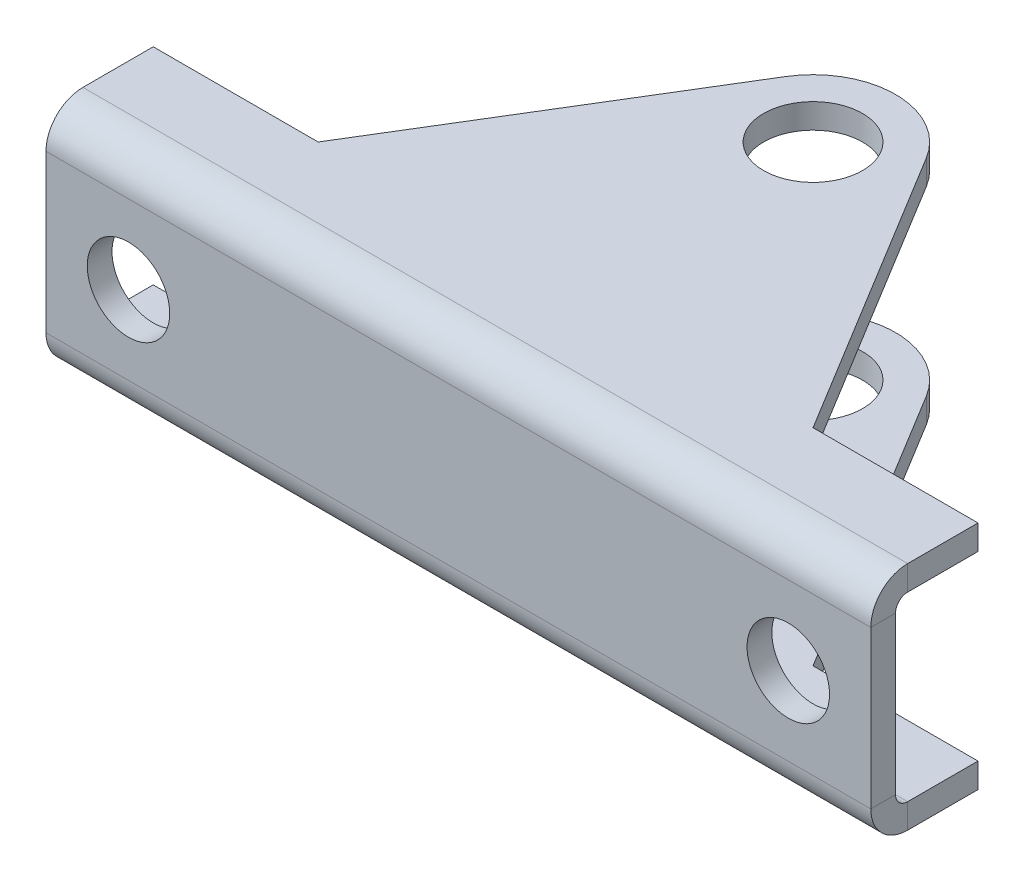
ISO-10303-21;
HEADER;
FILE_DESCRIPTION(('STEP AP214'),'2;1');
FILE_NAME('part.step','',(''),(''),'','','');
FILE_SCHEMA(('AUTOMOTIVE_DESIGN { 1 0 10303 214 1 1 1 1 }'));
ENDSEC;
DATA;
#1=APPLICATION_CONTEXT('core data for automotive mechanical design processes');
#2=APPLICATION_PROTOCOL_DEFINITION('international standard','automotive_design',2000,#1);
#3=PRODUCT_CONTEXT('',#1,'mechanical');
#4=PRODUCT('Part','Part','',(#3));
#5=PRODUCT_RELATED_PRODUCT_CATEGORY('part','',(#4));
#6=PRODUCT_DEFINITION_FORMATION('','',#4);
#7=PRODUCT_DEFINITION_CONTEXT('part definition',#1,'design');
#8=PRODUCT_DEFINITION('design','',#6,#7);
#9=PRODUCT_DEFINITION_SHAPE('','',#8);
#10=(LENGTH_UNIT() NAMED_UNIT(*) SI_UNIT(.MILLI.,.METRE.));
#11=(NAMED_UNIT(*) PLANE_ANGLE_UNIT() SI_UNIT($,.RADIAN.));
#12=(NAMED_UNIT(*) SI_UNIT($,.STERADIAN.) SOLID_ANGLE_UNIT());
#13=UNCERTAINTY_MEASURE_WITH_UNIT(LENGTH_MEASURE(1.E-05),#10,'distance_accuracy_value','');
#14=(GEOMETRIC_REPRESENTATION_CONTEXT(3) GLOBAL_UNCERTAINTY_ASSIGNED_CONTEXT((#13)) GLOBAL_UNIT_ASSIGNED_CONTEXT((#10,
#11,#12)) REPRESENTATION_CONTEXT('',''));
#15=CARTESIAN_POINT('',(0.,0.,0.));
#16=DIRECTION('',(0.,0.,1.));
#17=DIRECTION('',(1.,0.,0.));
#18=AXIS2_PLACEMENT_3D('',#15,#16,#17);
#19=CARTESIAN_POINT('',(25.,-7.00000000000002,-6.5));
#20=DIRECTION('',(0.,0.,-1.));
#21=DIRECTION('',(0.,1.,0.));
#22=AXIS2_PLACEMENT_3D('',#19,#20,#21);
#23=PLANE('',#22);
#24=DIRECTION('',(-1.,0.,0.));
#25=VECTOR('',#24,1.);
#26=CARTESIAN_POINT('',(25.,-5.50000000000002,-6.5));
#27=LINE('',#26,#25);
#28=CARTESIAN_POINT('',(-15.,-5.50000000000002,-6.50000000000002));
#29=VERTEX_POINT('',#28);
#30=CARTESIAN_POINT('',(-25.,-5.50000000000002,-6.5));
#31=VERTEX_POINT('',#30);
#32=EDGE_CURVE('E180',#29,#31,#27,.T.);
#33=ORIENTED_EDGE('',*,*,#32,.F.);
#34=DIRECTION('',(0.,-1.,0.));
#35=VECTOR('',#34,1.);
#36=CARTESIAN_POINT('',(-15.,-5.50000000000002,-6.50000000000002));
#37=LINE('',#36,#35);
#38=CARTESIAN_POINT('',(-15.,-7.00000000000002,-6.5));
#39=VERTEX_POINT('',#38);
#40=EDGE_CURVE('E187',#29,#39,#37,.T.);
#41=ORIENTED_EDGE('',*,*,#40,.T.);
#42=DIRECTION('',(-1.,0.,0.));
#43=VECTOR('',#42,1.);
#44=CARTESIAN_POINT('',(25.,-7.00000000000002,-6.5));
#45=LINE('',#44,#43);
#46=CARTESIAN_POINT('',(-25.,-7.00000000000002,-6.5));
#47=VERTEX_POINT('',#46);
#48=EDGE_CURVE('E403',#39,#47,#45,.T.);
#49=ORIENTED_EDGE('',*,*,#48,.T.);
#50=DIRECTION('',(0.,1.,0.));
#51=VECTOR('',#50,1.);
#52=CARTESIAN_POINT('',(-25.,-7.00000000000002,-6.5));
#53=LINE('',#52,#51);
#54=EDGE_CURVE('E195',#47,#31,#53,.T.);
#55=ORIENTED_EDGE('',*,*,#54,.T.);
#56=EDGE_LOOP('',(#33,#41,#49,#55));
#57=FACE_BOUND('',#56,.T.);
#58=ADVANCED_FACE('F35',(#57),#23,.T.);
#59=CARTESIAN_POINT('',(25.,7.00000000000002,-6.5));
#60=DIRECTION('',(0.,0.,-1.));
#61=DIRECTION('',(0.,1.,0.));
#62=AXIS2_PLACEMENT_3D('',#59,#60,#61);
#63=PLANE('',#62);
#64=DIRECTION('',(1.,0.,0.));
#65=VECTOR('',#64,1.);
#66=CARTESIAN_POINT('',(25.,5.50000000000002,-6.5));
#67=LINE('',#66,#65);
#68=CARTESIAN_POINT('',(15.,5.50000000000002,-6.50000000000002));
#69=VERTEX_POINT('',#68);
#70=CARTESIAN_POINT('',(25.,5.50000000000002,-6.5));
#71=VERTEX_POINT('',#70);
#72=EDGE_CURVE('E272',#69,#71,#67,.T.);
#73=ORIENTED_EDGE('',*,*,#72,.F.);
#74=DIRECTION('',(0.,1.,0.));
#75=VECTOR('',#74,1.);
#76=CARTESIAN_POINT('',(15.,5.50000000000002,-6.50000000000002));
#77=LINE('',#76,#75);
#78=CARTESIAN_POINT('',(15.,7.00000000000002,-6.5));
#79=VERTEX_POINT('',#78);
#80=EDGE_CURVE('E431',#69,#79,#77,.T.);
#81=ORIENTED_EDGE('',*,*,#80,.T.);
#82=DIRECTION('',(1.,0.,0.));
#83=VECTOR('',#82,1.);
#84=CARTESIAN_POINT('',(25.,7.00000000000002,-6.5));
#85=LINE('',#84,#83);
#86=CARTESIAN_POINT('',(25.,7.00000000000002,-6.5));
#87=VERTEX_POINT('',#86);
#88=EDGE_CURVE('E259',#79,#87,#85,.T.);
#89=ORIENTED_EDGE('',*,*,#88,.T.);
#90=DIRECTION('',(0.,-1.,0.));
#91=VECTOR('',#90,1.);
#92=CARTESIAN_POINT('',(25.,7.00000000000002,-6.5));
#93=LINE('',#92,#91);
#94=EDGE_CURVE('E282',#87,#71,#93,.T.);
#95=ORIENTED_EDGE('',*,*,#94,.T.);
#96=EDGE_LOOP('',(#73,#81,#89,#95));
#97=FACE_BOUND('',#96,.T.);
#98=ADVANCED_FACE('F473',(#97),#63,.T.);
#99=CARTESIAN_POINT('',(0.,0.,-1.5));
#100=DIRECTION('',(0.,0.,1.));
#101=DIRECTION('',(1.,0.,0.));
#102=AXIS2_PLACEMENT_3D('',#99,#100,#101);
#103=PLANE('',#102);
#104=CARTESIAN_POINT('',(20.,0.,-1.5));
#105=DIRECTION('',(0.,0.,1.));
#106=DIRECTION('',(1.,0.,0.));
#107=AXIS2_PLACEMENT_3D('',#104,#105,#106);
#108=CIRCLE('',#107,2.5);
#109=CARTESIAN_POINT('',(22.5,0.,-1.5));
#110=VERTEX_POINT('',#109);
#111=EDGE_CURVE('E312',#110,#110,#108,.T.);
#112=ORIENTED_EDGE('',*,*,#111,.T.);
#113=EDGE_LOOP('',(#112));
#114=FACE_BOUND('',#113,.T.);
#115=CARTESIAN_POINT('',(-20.,0.,-1.5));
#116=DIRECTION('',(0.,0.,1.));
#117=DIRECTION('',(1.,0.,0.));
#118=AXIS2_PLACEMENT_3D('',#115,#116,#117);
#119=CIRCLE('',#118,2.5);
#120=CARTESIAN_POINT('',(-17.5,0.,-1.5));
#121=VERTEX_POINT('',#120);
#122=EDGE_CURVE('E318',#121,#121,#119,.T.);
#123=ORIENTED_EDGE('',*,*,#122,.T.);
#124=EDGE_LOOP('',(#123));
#125=FACE_BOUND('',#124,.T.);
#126=DIRECTION('',(-1.,0.,0.));
#127=VECTOR('',#126,1.);
#128=CARTESIAN_POINT('',(-25.,-4.7634,-1.5));
#129=LINE('',#128,#127);
#130=CARTESIAN_POINT('',(-25.,-4.7634,-1.5));
#131=VERTEX_POINT('',#130);
#132=CARTESIAN_POINT('',(25.,-4.7634,-1.5));
#133=VERTEX_POINT('',#132);
#134=EDGE_CURVE('E236',#131,#133,#129,.F.);
#135=ORIENTED_EDGE('',*,*,#134,.F.);
#136=DIRECTION('',(0.,-1.,0.));
#137=VECTOR('',#136,1.);
#138=CARTESIAN_POINT('',(-25.,5.5,-1.5));
#139=LINE('',#138,#137);
#140=CARTESIAN_POINT('',(-25.,4.7634,-1.5));
#141=VERTEX_POINT('',#140);
#142=EDGE_CURVE('E11',#141,#131,#139,.T.);
#143=ORIENTED_EDGE('',*,*,#142,.F.);
#144=DIRECTION('',(1.,0.,0.));
#145=VECTOR('',#144,1.);
#146=CARTESIAN_POINT('',(25.,4.7634,-1.5));
#147=LINE('',#146,#145);
#148=CARTESIAN_POINT('',(25.,4.7634,-1.5));
#149=VERTEX_POINT('',#148);
#150=EDGE_CURVE('E302',#149,#141,#147,.F.);
#151=ORIENTED_EDGE('',*,*,#150,.F.);
#152=DIRECTION('',(0.,1.,0.));
#153=VECTOR('',#152,1.);
#154=CARTESIAN_POINT('',(25.,5.5,-1.5));
#155=LINE('',#154,#153);
#156=EDGE_CURVE('E44',#133,#149,#155,.T.);
#157=ORIENTED_EDGE('',*,*,#156,.F.);
#158=EDGE_LOOP('',(#135,#143,#151,#157));
#159=FACE_BOUND('',#158,.T.);
#160=ADVANCED_FACE('F350',(#114,#125,#159),#103,.F.);
#161=CARTESIAN_POINT('',(0.,0.,0.));
#162=DIRECTION('',(0.,0.,1.));
#163=DIRECTION('',(1.,0.,0.));
#164=AXIS2_PLACEMENT_3D('',#161,#162,#163);
#165=PLANE('',#164);
#166=CARTESIAN_POINT('',(20.,0.,0.));
#167=DIRECTION('',(0.,0.,1.));
#168=DIRECTION('',(1.,0.,0.));
#169=AXIS2_PLACEMENT_3D('',#166,#167,#168);
#170=CIRCLE('',#169,2.5);
#171=CARTESIAN_POINT('',(22.5,0.,0.));
#172=VERTEX_POINT('',#171);
#173=EDGE_CURVE('E309',#172,#172,#170,.T.);
#174=ORIENTED_EDGE('',*,*,#173,.F.);
#175=EDGE_LOOP('',(#174));
#176=FACE_BOUND('',#175,.T.);
#177=CARTESIAN_POINT('',(-20.,0.,0.));
#178=DIRECTION('',(0.,0.,1.));
#179=DIRECTION('',(1.,0.,0.));
#180=AXIS2_PLACEMENT_3D('',#177,#178,#179);
#181=CIRCLE('',#180,2.5);
#182=CARTESIAN_POINT('',(-17.5,0.,0.));
#183=VERTEX_POINT('',#182);
#184=EDGE_CURVE('E315',#183,#183,#181,.T.);
#185=ORIENTED_EDGE('',*,*,#184,.F.);
#186=EDGE_LOOP('',(#185));
#187=FACE_BOUND('',#186,.T.);
#188=DIRECTION('',(0.,-1.,0.));
#189=VECTOR('',#188,1.);
#190=CARTESIAN_POINT('',(-25.,5.5,0.));
#191=LINE('',#190,#189);
#192=CARTESIAN_POINT('',(-25.,4.7634,0.));
#193=VERTEX_POINT('',#192);
#194=CARTESIAN_POINT('',(-25.,-4.7634,0.));
#195=VERTEX_POINT('',#194);
#196=EDGE_CURVE('E325',#193,#195,#191,.T.);
#197=ORIENTED_EDGE('',*,*,#196,.T.);
#198=DIRECTION('',(-1.,0.,0.));
#199=VECTOR('',#198,1.);
#200=CARTESIAN_POINT('',(-25.,-4.7634,0.));
#201=LINE('',#200,#199);
#202=CARTESIAN_POINT('',(25.,-4.7634,0.));
#203=VERTEX_POINT('',#202);
#204=EDGE_CURVE('E223',#195,#203,#201,.F.);
#205=ORIENTED_EDGE('',*,*,#204,.T.);
#206=DIRECTION('',(0.,1.,0.));
#207=VECTOR('',#206,1.);
#208=CARTESIAN_POINT('',(25.,5.5,0.));
#209=LINE('',#208,#207);
#210=CARTESIAN_POINT('',(25.,4.7634,0.));
#211=VERTEX_POINT('',#210);
#212=EDGE_CURVE('E321',#203,#211,#209,.T.);
#213=ORIENTED_EDGE('',*,*,#212,.T.);
#214=DIRECTION('',(1.,0.,0.));
#215=VECTOR('',#214,1.);
#216=CARTESIAN_POINT('',(25.,4.7634,0.));
#217=LINE('',#216,#215);
#218=EDGE_CURVE('E289',#211,#193,#217,.F.);
#219=ORIENTED_EDGE('',*,*,#218,.T.);
#220=EDGE_LOOP('',(#197,#205,#213,#219));
#221=FACE_BOUND('',#220,.T.);
#222=ADVANCED_FACE('F331',(#176,#187,#221),#165,.T.);
#223=CARTESIAN_POINT('',(-25.,5.5,-1.5));
#224=DIRECTION('',(-1.,0.,0.));
#225=DIRECTION('',(0.,0.,1.));
#226=AXIS2_PLACEMENT_3D('',#223,#224,#225);
#227=PLANE('',#226);
#228=ORIENTED_EDGE('',*,*,#142,.T.);
#229=DIRECTION('',(0.,0.,1.));
#230=VECTOR('',#229,1.);
#231=CARTESIAN_POINT('',(-25.,-4.7634,-1.5));
#232=LINE('',#231,#230);
#233=EDGE_CURVE('E230',#131,#195,#232,.T.);
#234=ORIENTED_EDGE('',*,*,#233,.T.);
#235=ORIENTED_EDGE('',*,*,#196,.F.);
#236=DIRECTION('',(0.,0.,1.));
#237=VECTOR('',#236,1.);
#238=CARTESIAN_POINT('',(-25.,4.7634,-1.5));
#239=LINE('',#238,#237);
#240=EDGE_CURVE('E306',#141,#193,#239,.T.);
#241=ORIENTED_EDGE('',*,*,#240,.F.);
#242=EDGE_LOOP('',(#228,#234,#235,#241));
#243=FACE_BOUND('',#242,.T.);
#244=ADVANCED_FACE('F335',(#243),#227,.T.);
#245=CARTESIAN_POINT('',(25.,5.5,-1.5));
#246=DIRECTION('',(1.,0.,0.));
#247=DIRECTION('',(0.,0.,-1.));
#248=AXIS2_PLACEMENT_3D('',#245,#246,#247);
#249=PLANE('',#248);
#250=DIRECTION('',(0.,0.,1.));
#251=VECTOR('',#250,1.);
#252=CARTESIAN_POINT('',(25.,-4.7634,-1.5));
#253=LINE('',#252,#251);
#254=EDGE_CURVE('E240',#133,#203,#253,.T.);
#255=ORIENTED_EDGE('',*,*,#254,.F.);
#256=ORIENTED_EDGE('',*,*,#156,.T.);
#257=DIRECTION('',(0.,0.,1.));
#258=VECTOR('',#257,1.);
#259=CARTESIAN_POINT('',(25.,4.7634,-1.5));
#260=LINE('',#259,#258);
#261=EDGE_CURVE('E296',#149,#211,#260,.T.);
#262=ORIENTED_EDGE('',*,*,#261,.T.);
#263=ORIENTED_EDGE('',*,*,#212,.F.);
#264=EDGE_LOOP('',(#255,#256,#262,#263));
#265=FACE_BOUND('',#264,.T.);
#266=ADVANCED_FACE('F37',(#265),#249,.T.);
#267=CARTESIAN_POINT('',(-20.,0.,-1.5));
#268=DIRECTION('',(0.,0.,1.));
#269=DIRECTION('',(1.,0.,0.));
#270=AXIS2_PLACEMENT_3D('',#267,#268,#269);
#271=CYLINDRICAL_SURFACE('',#270,2.5);
#272=ORIENTED_EDGE('',*,*,#122,.F.);
#273=EDGE_LOOP('',(#272));
#274=FACE_BOUND('',#273,.T.);
#275=ORIENTED_EDGE('',*,*,#184,.T.);
#276=EDGE_LOOP('',(#275));
#277=FACE_BOUND('',#276,.T.);
#278=ADVANCED_FACE('F612',(#274,#277),#271,.F.);
#279=CARTESIAN_POINT('',(20.,0.,-1.5));
#280=DIRECTION('',(0.,0.,1.));
#281=DIRECTION('',(1.,0.,0.));
#282=AXIS2_PLACEMENT_3D('',#279,#280,#281);
#283=CYLINDRICAL_SURFACE('',#282,2.5);
#284=ORIENTED_EDGE('',*,*,#111,.F.);
#285=EDGE_LOOP('',(#284));
#286=FACE_BOUND('',#285,.T.);
#287=ORIENTED_EDGE('',*,*,#173,.T.);
#288=EDGE_LOOP('',(#287));
#289=FACE_BOUND('',#288,.T.);
#290=ADVANCED_FACE('F599',(#286,#289),#283,.F.);
#291=CARTESIAN_POINT('',(-25.,4.7634,-2.2366));
#292=DIRECTION('',(-1.,0.,0.));
#293=DIRECTION('',(0.,0.,1.));
#294=AXIS2_PLACEMENT_3D('',#291,#292,#293);
#295=PLANE('',#294);
#296=DIRECTION('',(0.,1.,0.));
#297=VECTOR('',#296,1.);
#298=CARTESIAN_POINT('',(-25.,5.5,-2.2366));
#299=LINE('',#298,#297);
#300=CARTESIAN_POINT('',(-25.,5.5,-2.2366));
#301=VERTEX_POINT('',#300);
#302=CARTESIAN_POINT('',(-25.,7.,-2.23659999999999));
#303=VERTEX_POINT('',#302);
#304=EDGE_CURVE('E243',#301,#303,#299,.T.);
#305=ORIENTED_EDGE('',*,*,#304,.F.);
#306=CARTESIAN_POINT('',(-25.,4.7634,-2.2366));
#307=DIRECTION('',(1.,0.,0.));
#308=DIRECTION('',(0.,0.,-1.));
#309=AXIS2_PLACEMENT_3D('',#306,#307,#308);
#310=CIRCLE('',#309,0.7366);
#311=EDGE_CURVE('E299',#141,#301,#310,.F.);
#312=ORIENTED_EDGE('',*,*,#311,.F.);
#313=ORIENTED_EDGE('',*,*,#240,.T.);
#314=CARTESIAN_POINT('',(-25.,4.7634,-2.2366));
#315=DIRECTION('',(1.,0.,0.));
#316=DIRECTION('',(0.,0.,-1.));
#317=AXIS2_PLACEMENT_3D('',#314,#315,#316);
#318=CIRCLE('',#317,2.2366);
#319=EDGE_CURVE('E292',#193,#303,#318,.F.);
#320=ORIENTED_EDGE('',*,*,#319,.T.);
#321=EDGE_LOOP('',(#305,#312,#313,#320));
#322=FACE_BOUND('',#321,.T.);
#323=ADVANCED_FACE('F588',(#322),#295,.T.);
#324=CARTESIAN_POINT('',(25.,4.7634,-2.2366));
#325=DIRECTION('',(-1.,0.,0.));
#326=DIRECTION('',(0.,0.,1.));
#327=AXIS2_PLACEMENT_3D('',#324,#325,#326);
#328=PLANE('',#327);
#329=CARTESIAN_POINT('',(25.,4.7634,-2.2366));
#330=DIRECTION('',(1.,0.,0.));
#331=DIRECTION('',(0.,0.,-1.));
#332=AXIS2_PLACEMENT_3D('',#329,#330,#331);
#333=CIRCLE('',#332,0.7366);
#334=CARTESIAN_POINT('',(25.,5.5,-2.2366));
#335=VERTEX_POINT('',#334);
#336=EDGE_CURVE('E285',#335,#149,#333,.T.);
#337=ORIENTED_EDGE('',*,*,#336,.F.);
#338=DIRECTION('',(0.,1.,0.));
#339=VECTOR('',#338,1.);
#340=CARTESIAN_POINT('',(25.,5.5,-2.2366));
#341=LINE('',#340,#339);
#342=CARTESIAN_POINT('',(25.,7.,-2.23659999999999));
#343=VERTEX_POINT('',#342);
#344=EDGE_CURVE('E248',#335,#343,#341,.T.);
#345=ORIENTED_EDGE('',*,*,#344,.T.);
#346=CARTESIAN_POINT('',(25.,4.7634,-2.2366));
#347=DIRECTION('',(1.,0.,0.));
#348=DIRECTION('',(0.,0.,-1.));
#349=AXIS2_PLACEMENT_3D('',#346,#347,#348);
#350=CIRCLE('',#349,2.2366);
#351=EDGE_CURVE('E293',#343,#211,#350,.T.);
#352=ORIENTED_EDGE('',*,*,#351,.T.);
#353=ORIENTED_EDGE('',*,*,#261,.F.);
#354=EDGE_LOOP('',(#337,#345,#352,#353));
#355=FACE_BOUND('',#354,.T.);
#356=ADVANCED_FACE('F577',(#355),#328,.F.);
#357=CARTESIAN_POINT('',(25.,4.7634,-2.2366));
#358=DIRECTION('',(1.,0.,0.));
#359=DIRECTION('',(0.,1.,0.));
#360=AXIS2_PLACEMENT_3D('',#357,#358,#359);
#361=CYLINDRICAL_SURFACE('',#360,2.2366);
#362=ORIENTED_EDGE('',*,*,#218,.F.);
#363=ORIENTED_EDGE('',*,*,#351,.F.);
#364=DIRECTION('',(1.,0.,0.));
#365=VECTOR('',#364,1.);
#366=CARTESIAN_POINT('',(0.,7.,-2.23659999999999));
#367=LINE('',#366,#365);
#368=EDGE_CURVE('E251',#303,#343,#367,.T.);
#369=ORIENTED_EDGE('',*,*,#368,.F.);
#370=ORIENTED_EDGE('',*,*,#319,.F.);
#371=EDGE_LOOP('',(#362,#363,#369,#370));
#372=FACE_BOUND('',#371,.T.);
#373=ADVANCED_FACE('F566',(#372),#361,.T.);
#374=CARTESIAN_POINT('',(25.,4.7634,-2.2366));
#375=DIRECTION('',(1.,0.,0.));
#376=DIRECTION('',(0.,1.,0.));
#377=AXIS2_PLACEMENT_3D('',#374,#375,#376);
#378=CYLINDRICAL_SURFACE('',#377,0.7366);
#379=ORIENTED_EDGE('',*,*,#150,.T.);
#380=ORIENTED_EDGE('',*,*,#311,.T.);
#381=DIRECTION('',(1.,0.,0.));
#382=VECTOR('',#381,1.);
#383=CARTESIAN_POINT('',(-25.,5.5,-2.2366));
#384=LINE('',#383,#382);
#385=EDGE_CURVE('E246',#301,#335,#384,.T.);
#386=ORIENTED_EDGE('',*,*,#385,.T.);
#387=ORIENTED_EDGE('',*,*,#336,.T.);
#388=EDGE_LOOP('',(#379,#380,#386,#387));
#389=FACE_BOUND('',#388,.T.);
#390=ADVANCED_FACE('F555',(#389),#378,.F.);
#391=CARTESIAN_POINT('',(25.,7.,-1.49999999999999));
#392=DIRECTION('',(1.,0.,0.));
#393=DIRECTION('',(0.,0.,-1.));
#394=AXIS2_PLACEMENT_3D('',#391,#392,#393);
#395=PLANE('',#394);
#396=DIRECTION('',(0.,0.,1.));
#397=VECTOR('',#396,1.);
#398=CARTESIAN_POINT('',(25.,7.,-1.49999999999999));
#399=LINE('',#398,#397);
#400=EDGE_CURVE('E263',#87,#343,#399,.T.);
#401=ORIENTED_EDGE('',*,*,#400,.T.);
#402=ORIENTED_EDGE('',*,*,#344,.F.);
#403=DIRECTION('',(0.,0.,1.));
#404=VECTOR('',#403,1.);
#405=CARTESIAN_POINT('',(25.,5.5,-1.5));
#406=LINE('',#405,#404);
#407=EDGE_CURVE('E260',#71,#335,#406,.T.);
#408=ORIENTED_EDGE('',*,*,#407,.F.);
#409=ORIENTED_EDGE('',*,*,#94,.F.);
#410=EDGE_LOOP('',(#401,#402,#408,#409));
#411=FACE_BOUND('',#410,.T.);
#412=ADVANCED_FACE('F542',(#411),#395,.T.);
#413=CARTESIAN_POINT('',(-25.,7.00000000000002,-6.5));
#414=DIRECTION('',(-1.,0.,0.));
#415=DIRECTION('',(0.,0.,1.));
#416=AXIS2_PLACEMENT_3D('',#413,#414,#415);
#417=PLANE('',#416);
#418=DIRECTION('',(0.,0.,-1.));
#419=VECTOR('',#418,1.);
#420=CARTESIAN_POINT('',(-25.,5.50000000000002,-6.5));
#421=LINE('',#420,#419);
#422=CARTESIAN_POINT('',(-25.,5.50000000000002,-6.5));
#423=VERTEX_POINT('',#422);
#424=EDGE_CURVE('E256',#301,#423,#421,.T.);
#425=ORIENTED_EDGE('',*,*,#424,.F.);
#426=ORIENTED_EDGE('',*,*,#304,.T.);
#427=DIRECTION('',(0.,0.,-1.));
#428=VECTOR('',#427,1.);
#429=CARTESIAN_POINT('',(-25.,7.00000000000002,-6.5));
#430=LINE('',#429,#428);
#431=CARTESIAN_POINT('',(-25.,7.00000000000002,-6.5));
#432=VERTEX_POINT('',#431);
#433=EDGE_CURVE('E257',#303,#432,#430,.T.);
#434=ORIENTED_EDGE('',*,*,#433,.T.);
#435=DIRECTION('',(0.,-1.,0.));
#436=VECTOR('',#435,1.);
#437=CARTESIAN_POINT('',(-25.,7.00000000000002,-6.5));
#438=LINE('',#437,#436);
#439=EDGE_CURVE('E286',#432,#423,#438,.T.);
#440=ORIENTED_EDGE('',*,*,#439,.T.);
#441=EDGE_LOOP('',(#425,#426,#434,#440));
#442=FACE_BOUND('',#441,.T.);
#443=ADVANCED_FACE('F536',(#442),#417,.T.);
#444=CARTESIAN_POINT('',(0.,7.,0.));
#445=DIRECTION('',(0.,1.,0.));
#446=DIRECTION('',(0.,0.,1.));
#447=AXIS2_PLACEMENT_3D('',#444,#445,#446);
#448=PLANE('',#447);
#449=ORIENTED_EDGE('',*,*,#433,.F.);
#450=ORIENTED_EDGE('',*,*,#368,.T.);
#451=ORIENTED_EDGE('',*,*,#400,.F.);
#452=ORIENTED_EDGE('',*,*,#88,.F.);
#453=DIRECTION('',(-0.52051760426961,0.,-0.853850937602944));
#454=VECTOR('',#453,1.);
#455=CARTESIAN_POINT('',(15.,7.00000000000002,-6.50000000000001));
#456=LINE('',#455,#454);
#457=CARTESIAN_POINT('',(4.26925468801472,7.00000000000008,-24.1025880213481));
#458=VERTEX_POINT('',#457);
#459=EDGE_CURVE('E60',#79,#458,#456,.T.);
#460=ORIENTED_EDGE('',*,*,#459,.T.);
#461=CARTESIAN_POINT('',(0.,7.00000000000007,-21.5));
#462=DIRECTION('',(0.,1.,0.));
#463=DIRECTION('',(0.,0.,-1.));
#464=AXIS2_PLACEMENT_3D('',#461,#462,#463);
#465=CIRCLE('',#464,5.);
#466=CARTESIAN_POINT('',(-4.26925468801472,7.00000000000008,-24.1025880213481));
#467=VERTEX_POINT('',#466);
#468=EDGE_CURVE('E416',#458,#467,#465,.T.);
#469=ORIENTED_EDGE('',*,*,#468,.T.);
#470=DIRECTION('',(-0.520517604269611,0.,0.853850937602943));
#471=VECTOR('',#470,1.);
#472=CARTESIAN_POINT('',(-15.,7.00000000000002,-6.50000000000001));
#473=LINE('',#472,#471);
#474=CARTESIAN_POINT('',(-15.,7.00000000000002,-6.50000000000001));
#475=VERTEX_POINT('',#474);
#476=EDGE_CURVE('E419',#467,#475,#473,.T.);
#477=ORIENTED_EDGE('',*,*,#476,.T.);
#478=EDGE_CURVE('E269',#432,#475,#85,.T.);
#479=ORIENTED_EDGE('',*,*,#478,.F.);
#480=EDGE_LOOP('',(#449,#450,#451,#452,#460,#469,#477,#479));
#481=FACE_BOUND('',#480,.T.);
#482=CARTESIAN_POINT('',(0.,7.00000000000007,-21.5));
#483=DIRECTION('',(0.,1.,0.));
#484=DIRECTION('',(0.,0.,1.));
#485=AXIS2_PLACEMENT_3D('',#482,#483,#484);
#486=CIRCLE('',#485,3.);
#487=CARTESIAN_POINT('',(0.,7.00000000000006,-18.5));
#488=VERTEX_POINT('',#487);
#489=EDGE_CURVE('E394',#488,#488,#486,.T.);
#490=ORIENTED_EDGE('',*,*,#489,.F.);
#491=EDGE_LOOP('',(#490));
#492=FACE_BOUND('',#491,.T.);
#493=ADVANCED_FACE('F541',(#481,#492),#448,.T.);
#494=CARTESIAN_POINT('',(0.,5.5,0.));
#495=DIRECTION('',(0.,1.,0.));
#496=DIRECTION('',(0.,0.,1.));
#497=AXIS2_PLACEMENT_3D('',#494,#495,#496);
#498=PLANE('',#497);
#499=ORIENTED_EDGE('',*,*,#385,.F.);
#500=ORIENTED_EDGE('',*,*,#424,.T.);
#501=CARTESIAN_POINT('',(-15.,5.50000000000002,-6.50000000000002));
#502=VERTEX_POINT('',#501);
#503=EDGE_CURVE('E275',#423,#502,#67,.T.);
#504=ORIENTED_EDGE('',*,*,#503,.T.);
#505=DIRECTION('',(-0.520517604269611,0.,0.853850937602943));
#506=VECTOR('',#505,1.);
#507=CARTESIAN_POINT('',(-15.,5.50000000000002,-6.50000000000002));
#508=LINE('',#507,#506);
#509=CARTESIAN_POINT('',(-4.26925468801472,5.50000000000008,-24.1025880213481));
#510=VERTEX_POINT('',#509);
#511=EDGE_CURVE('E414',#510,#502,#508,.T.);
#512=ORIENTED_EDGE('',*,*,#511,.F.);
#513=CARTESIAN_POINT('',(0.,5.50000000000007,-21.5));
#514=DIRECTION('',(0.,1.,0.));
#515=DIRECTION('',(0.,0.,-1.));
#516=AXIS2_PLACEMENT_3D('',#513,#514,#515);
#517=CIRCLE('',#516,5.);
#518=CARTESIAN_POINT('',(4.26925468801472,5.50000000000008,-24.1025880213481));
#519=VERTEX_POINT('',#518);
#520=EDGE_CURVE('E411',#519,#510,#517,.T.);
#521=ORIENTED_EDGE('',*,*,#520,.F.);
#522=DIRECTION('',(-0.52051760426961,0.,-0.853850937602944));
#523=VECTOR('',#522,1.);
#524=CARTESIAN_POINT('',(15.,5.50000000000002,-6.50000000000002));
#525=LINE('',#524,#523);
#526=EDGE_CURVE('E415',#69,#519,#525,.T.);
#527=ORIENTED_EDGE('',*,*,#526,.F.);
#528=ORIENTED_EDGE('',*,*,#72,.T.);
#529=ORIENTED_EDGE('',*,*,#407,.T.);
#530=EDGE_LOOP('',(#499,#500,#504,#512,#521,#527,#528,#529));
#531=FACE_BOUND('',#530,.T.);
#532=CARTESIAN_POINT('',(0.,5.50000000000007,-21.5));
#533=DIRECTION('',(0.,1.,0.));
#534=DIRECTION('',(0.,0.,1.));
#535=AXIS2_PLACEMENT_3D('',#532,#533,#534);
#536=CIRCLE('',#535,3.);
#537=CARTESIAN_POINT('',(0.,5.50000000000006,-18.5));
#538=VERTEX_POINT('',#537);
#539=EDGE_CURVE('E406',#538,#538,#536,.T.);
#540=ORIENTED_EDGE('',*,*,#539,.T.);
#541=EDGE_LOOP('',(#540));
#542=FACE_BOUND('',#541,.T.);
#543=ADVANCED_FACE('F664',(#531,#542),#498,.F.);
#544=DIRECTION('',(0.,1.,0.));
#545=VECTOR('',#544,1.);
#546=CARTESIAN_POINT('',(-15.,5.50000000000002,-6.50000000000002));
#547=LINE('',#546,#545);
#548=EDGE_CURVE('E425',#502,#475,#547,.T.);
#549=ORIENTED_EDGE('',*,*,#548,.F.);
#550=ORIENTED_EDGE('',*,*,#503,.F.);
#551=ORIENTED_EDGE('',*,*,#439,.F.);
#552=ORIENTED_EDGE('',*,*,#478,.T.);
#553=EDGE_LOOP('',(#549,#550,#551,#552));
#554=FACE_BOUND('',#553,.T.);
#555=ADVANCED_FACE('F480',(#554),#63,.T.);
#556=CARTESIAN_POINT('',(25.,-4.7634,-2.2366));
#557=DIRECTION('',(1.,0.,0.));
#558=DIRECTION('',(0.,0.,-1.));
#559=AXIS2_PLACEMENT_3D('',#556,#557,#558);
#560=PLANE('',#559);
#561=DIRECTION('',(0.,-1.,0.));
#562=VECTOR('',#561,1.);
#563=CARTESIAN_POINT('',(25.,-5.5,-2.2366));
#564=LINE('',#563,#562);
#565=CARTESIAN_POINT('',(25.,-5.5,-2.2366));
#566=VERTEX_POINT('',#565);
#567=CARTESIAN_POINT('',(25.,-7.,-2.23659999999999));
#568=VERTEX_POINT('',#567);
#569=EDGE_CURVE('E357',#566,#568,#564,.T.);
#570=ORIENTED_EDGE('',*,*,#569,.F.);
#571=CARTESIAN_POINT('',(25.,-4.7634,-2.2366));
#572=DIRECTION('',(-1.,0.,0.));
#573=DIRECTION('',(0.,0.,1.));
#574=AXIS2_PLACEMENT_3D('',#571,#572,#573);
#575=CIRCLE('',#574,0.7366);
#576=EDGE_CURVE('E233',#133,#566,#575,.F.);
#577=ORIENTED_EDGE('',*,*,#576,.F.);
#578=ORIENTED_EDGE('',*,*,#254,.T.);
#579=CARTESIAN_POINT('',(25.,-4.7634,-2.2366));
#580=DIRECTION('',(-1.,0.,0.));
#581=DIRECTION('',(0.,0.,1.));
#582=AXIS2_PLACEMENT_3D('',#579,#580,#581);
#583=CIRCLE('',#582,2.2366);
#584=EDGE_CURVE('E226',#203,#568,#583,.F.);
#585=ORIENTED_EDGE('',*,*,#584,.T.);
#586=EDGE_LOOP('',(#570,#577,#578,#585));
#587=FACE_BOUND('',#586,.T.);
#588=ADVANCED_FACE('F355',(#587),#560,.T.);
#589=CARTESIAN_POINT('',(-25.,-4.7634,-2.2366));
#590=DIRECTION('',(1.,0.,0.));
#591=DIRECTION('',(0.,0.,-1.));
#592=AXIS2_PLACEMENT_3D('',#589,#590,#591);
#593=PLANE('',#592);
#594=CARTESIAN_POINT('',(-25.,-4.7634,-2.2366));
#595=DIRECTION('',(-1.,0.,0.));
#596=DIRECTION('',(0.,0.,1.));
#597=AXIS2_PLACEMENT_3D('',#594,#595,#596);
#598=CIRCLE('',#597,0.7366);
#599=CARTESIAN_POINT('',(-25.,-5.5,-2.2366));
#600=VERTEX_POINT('',#599);
#601=EDGE_CURVE('E218',#600,#131,#598,.T.);
#602=ORIENTED_EDGE('',*,*,#601,.F.);
#603=DIRECTION('',(0.,-1.,0.));
#604=VECTOR('',#603,1.);
#605=CARTESIAN_POINT('',(-25.,-5.5,-2.2366));
#606=LINE('',#605,#604);
#607=CARTESIAN_POINT('',(-25.,-7.,-2.23659999999999));
#608=VERTEX_POINT('',#607);
#609=EDGE_CURVE('E359',#600,#608,#606,.T.);
#610=ORIENTED_EDGE('',*,*,#609,.T.);
#611=CARTESIAN_POINT('',(-25.,-4.7634,-2.2366));
#612=DIRECTION('',(-1.,0.,0.));
#613=DIRECTION('',(0.,0.,1.));
#614=AXIS2_PLACEMENT_3D('',#611,#612,#613);
#615=CIRCLE('',#614,2.2366);
#616=EDGE_CURVE('E227',#608,#195,#615,.T.);
#617=ORIENTED_EDGE('',*,*,#616,.T.);
#618=ORIENTED_EDGE('',*,*,#233,.F.);
#619=EDGE_LOOP('',(#602,#610,#617,#618));
#620=FACE_BOUND('',#619,.T.);
#621=ADVANCED_FACE('F339',(#620),#593,.F.);
#622=CARTESIAN_POINT('',(-25.,-4.7634,-2.2366));
#623=DIRECTION('',(-1.,0.,0.));
#624=DIRECTION('',(0.,-1.,0.));
#625=AXIS2_PLACEMENT_3D('',#622,#623,#624);
#626=CYLINDRICAL_SURFACE('',#625,2.2366);
#627=ORIENTED_EDGE('',*,*,#204,.F.);
#628=ORIENTED_EDGE('',*,*,#616,.F.);
#629=DIRECTION('',(1.,0.,0.));
#630=VECTOR('',#629,1.);
#631=CARTESIAN_POINT('',(0.,-7.,-2.23659999999999));
#632=LINE('',#631,#630);
#633=EDGE_CURVE('E203',#608,#568,#632,.T.);
#634=ORIENTED_EDGE('',*,*,#633,.T.);
#635=ORIENTED_EDGE('',*,*,#584,.F.);
#636=EDGE_LOOP('',(#627,#628,#634,#635));
#637=FACE_BOUND('',#636,.T.);
#638=ADVANCED_FACE('F462',(#637),#626,.T.);
#639=CARTESIAN_POINT('',(-25.,-4.7634,-2.2366));
#640=DIRECTION('',(-1.,0.,0.));
#641=DIRECTION('',(0.,-1.,0.));
#642=AXIS2_PLACEMENT_3D('',#639,#640,#641);
#643=CYLINDRICAL_SURFACE('',#642,0.7366);
#644=ORIENTED_EDGE('',*,*,#134,.T.);
#645=ORIENTED_EDGE('',*,*,#576,.T.);
#646=DIRECTION('',(-1.,0.,0.));
#647=VECTOR('',#646,1.);
#648=CARTESIAN_POINT('',(25.,-5.5,-2.2366));
#649=LINE('',#648,#647);
#650=EDGE_CURVE('E347',#566,#600,#649,.T.);
#651=ORIENTED_EDGE('',*,*,#650,.T.);
#652=ORIENTED_EDGE('',*,*,#601,.T.);
#653=EDGE_LOOP('',(#644,#645,#651,#652));
#654=FACE_BOUND('',#653,.T.);
#655=ADVANCED_FACE('F344',(#654),#643,.F.);
#656=CARTESIAN_POINT('',(25.,-7.,-1.49999999999999));
#657=DIRECTION('',(1.,0.,0.));
#658=DIRECTION('',(0.,0.,-1.));
#659=AXIS2_PLACEMENT_3D('',#656,#657,#658);
#660=PLANE('',#659);
#661=DIRECTION('',(0.,0.,-1.));
#662=VECTOR('',#661,1.);
#663=CARTESIAN_POINT('',(25.,-5.5,-1.5));
#664=LINE('',#663,#662);
#665=CARTESIAN_POINT('',(25.,-5.50000000000002,-6.5));
#666=VERTEX_POINT('',#665);
#667=EDGE_CURVE('E198',#566,#666,#664,.T.);
#668=ORIENTED_EDGE('',*,*,#667,.F.);
#669=ORIENTED_EDGE('',*,*,#569,.T.);
#670=DIRECTION('',(0.,0.,-1.));
#671=VECTOR('',#670,1.);
#672=CARTESIAN_POINT('',(25.,-7.,-1.49999999999999));
#673=LINE('',#672,#671);
#674=CARTESIAN_POINT('',(25.,-7.00000000000002,-6.5));
#675=VERTEX_POINT('',#674);
#676=EDGE_CURVE('E216',#568,#675,#673,.T.);
#677=ORIENTED_EDGE('',*,*,#676,.T.);
#678=DIRECTION('',(0.,1.,0.));
#679=VECTOR('',#678,1.);
#680=CARTESIAN_POINT('',(25.,-7.00000000000002,-6.5));
#681=LINE('',#680,#679);
#682=EDGE_CURVE('E219',#675,#666,#681,.T.);
#683=ORIENTED_EDGE('',*,*,#682,.T.);
#684=EDGE_LOOP('',(#668,#669,#677,#683));
#685=FACE_BOUND('',#684,.T.);
#686=ADVANCED_FACE('F362',(#685),#660,.T.);
#687=CARTESIAN_POINT('',(-25.,-7.00000000000002,-6.5));
#688=DIRECTION('',(-1.,0.,0.));
#689=DIRECTION('',(0.,0.,1.));
#690=AXIS2_PLACEMENT_3D('',#687,#688,#689);
#691=PLANE('',#690);
#692=DIRECTION('',(0.,0.,1.));
#693=VECTOR('',#692,1.);
#694=CARTESIAN_POINT('',(-25.,-7.00000000000002,-6.5));
#695=LINE('',#694,#693);
#696=EDGE_CURVE('E222',#47,#608,#695,.T.);
#697=ORIENTED_EDGE('',*,*,#696,.T.);
#698=ORIENTED_EDGE('',*,*,#609,.F.);
#699=DIRECTION('',(0.,0.,1.));
#700=VECTOR('',#699,1.);
#701=CARTESIAN_POINT('',(-25.,-5.50000000000002,-6.5));
#702=LINE('',#701,#700);
#703=EDGE_CURVE('E201',#31,#600,#702,.T.);
#704=ORIENTED_EDGE('',*,*,#703,.F.);
#705=ORIENTED_EDGE('',*,*,#54,.F.);
#706=EDGE_LOOP('',(#697,#698,#704,#705));
#707=FACE_BOUND('',#706,.T.);
#708=ADVANCED_FACE('F457',(#707),#691,.T.);
#709=CARTESIAN_POINT('',(0.,-6.99999999999999,0.));
#710=DIRECTION('',(0.,1.,0.));
#711=DIRECTION('',(0.,0.,1.));
#712=AXIS2_PLACEMENT_3D('',#709,#710,#711);
#713=PLANE('',#712);
#714=ORIENTED_EDGE('',*,*,#633,.F.);
#715=ORIENTED_EDGE('',*,*,#696,.F.);
#716=ORIENTED_EDGE('',*,*,#48,.F.);
#717=DIRECTION('',(-0.520517604269611,0.,0.853850937602943));
#718=VECTOR('',#717,1.);
#719=CARTESIAN_POINT('',(-15.,-7.00000000000002,-6.50000000000001));
#720=LINE('',#719,#718);
#721=CARTESIAN_POINT('',(-4.26925468801472,-7.00000000000008,-24.1025880213481));
#722=VERTEX_POINT('',#721);
#723=EDGE_CURVE('E52',#722,#39,#720,.T.);
#724=ORIENTED_EDGE('',*,*,#723,.F.);
#725=CARTESIAN_POINT('',(0.,-7.00000000000007,-21.5));
#726=DIRECTION('',(0.,1.,0.));
#727=DIRECTION('',(0.,0.,-1.));
#728=AXIS2_PLACEMENT_3D('',#725,#726,#727);
#729=CIRCLE('',#728,5.);
#730=CARTESIAN_POINT('',(4.26925468801472,-7.00000000000008,-24.1025880213481));
#731=VERTEX_POINT('',#730);
#732=EDGE_CURVE('E388',#731,#722,#729,.T.);
#733=ORIENTED_EDGE('',*,*,#732,.F.);
#734=DIRECTION('',(-0.52051760426961,0.,-0.853850937602944));
#735=VECTOR('',#734,1.);
#736=CARTESIAN_POINT('',(15.,-7.00000000000002,-6.50000000000001));
#737=LINE('',#736,#735);
#738=CARTESIAN_POINT('',(15.,-7.00000000000002,-6.50000000000001));
#739=VERTEX_POINT('',#738);
#740=EDGE_CURVE('E185',#739,#731,#737,.T.);
#741=ORIENTED_EDGE('',*,*,#740,.F.);
#742=EDGE_CURVE('E208',#675,#739,#45,.T.);
#743=ORIENTED_EDGE('',*,*,#742,.F.);
#744=ORIENTED_EDGE('',*,*,#676,.F.);
#745=EDGE_LOOP('',(#714,#715,#716,#724,#733,#741,#743,#744));
#746=FACE_BOUND('',#745,.T.);
#747=CARTESIAN_POINT('',(0.,-7.00000000000007,-21.5));
#748=DIRECTION('',(0.,1.,0.));
#749=DIRECTION('',(0.,0.,1.));
#750=AXIS2_PLACEMENT_3D('',#747,#748,#749);
#751=CIRCLE('',#750,3.);
#752=CARTESIAN_POINT('',(0.,-7.00000000000006,-18.5));
#753=VERTEX_POINT('',#752);
#754=EDGE_CURVE('E386',#753,#753,#751,.T.);
#755=ORIENTED_EDGE('',*,*,#754,.T.);
#756=EDGE_LOOP('',(#755));
#757=FACE_BOUND('',#756,.T.);
#758=ADVANCED_FACE('F459',(#746,#757),#713,.F.);
#759=CARTESIAN_POINT('',(0.,-5.49999999999999,0.));
#760=DIRECTION('',(0.,1.,0.));
#761=DIRECTION('',(0.,0.,1.));
#762=AXIS2_PLACEMENT_3D('',#759,#760,#761);
#763=PLANE('',#762);
#764=ORIENTED_EDGE('',*,*,#703,.T.);
#765=ORIENTED_EDGE('',*,*,#650,.F.);
#766=ORIENTED_EDGE('',*,*,#667,.T.);
#767=CARTESIAN_POINT('',(15.,-5.50000000000002,-6.50000000000002));
#768=VERTEX_POINT('',#767);
#769=EDGE_CURVE('E197',#666,#768,#27,.T.);
#770=ORIENTED_EDGE('',*,*,#769,.T.);
#771=DIRECTION('',(-0.52051760426961,0.,-0.853850937602944));
#772=VECTOR('',#771,1.);
#773=CARTESIAN_POINT('',(15.,-5.50000000000002,-6.50000000000002));
#774=LINE('',#773,#772);
#775=CARTESIAN_POINT('',(4.26925468801472,-5.50000000000008,-24.1025880213481));
#776=VERTEX_POINT('',#775);
#777=EDGE_CURVE('E192',#768,#776,#774,.T.);
#778=ORIENTED_EDGE('',*,*,#777,.T.);
#779=CARTESIAN_POINT('',(0.,-5.50000000000007,-21.5));
#780=DIRECTION('',(0.,1.,0.));
#781=DIRECTION('',(0.,0.,-1.));
#782=AXIS2_PLACEMENT_3D('',#779,#780,#781);
#783=CIRCLE('',#782,5.);
#784=CARTESIAN_POINT('',(-4.26925468801472,-5.50000000000008,-24.1025880213481));
#785=VERTEX_POINT('',#784);
#786=EDGE_CURVE('E183',#776,#785,#783,.T.);
#787=ORIENTED_EDGE('',*,*,#786,.T.);
#788=DIRECTION('',(-0.520517604269611,0.,0.853850937602943));
#789=VECTOR('',#788,1.);
#790=CARTESIAN_POINT('',(-15.,-5.50000000000002,-6.50000000000002));
#791=LINE('',#790,#789);
#792=EDGE_CURVE('E175',#785,#29,#791,.T.);
#793=ORIENTED_EDGE('',*,*,#792,.T.);
#794=ORIENTED_EDGE('',*,*,#32,.T.);
#795=EDGE_LOOP('',(#764,#765,#766,#770,#778,#787,#793,#794));
#796=FACE_BOUND('',#795,.T.);
#797=CARTESIAN_POINT('',(0.,-5.50000000000007,-21.5));
#798=DIRECTION('',(0.,1.,0.));
#799=DIRECTION('',(0.,0.,1.));
#800=AXIS2_PLACEMENT_3D('',#797,#798,#799);
#801=CIRCLE('',#800,3.);
#802=CARTESIAN_POINT('',(0.,-5.50000000000006,-18.5));
#803=VERTEX_POINT('',#802);
#804=EDGE_CURVE('E401',#803,#803,#801,.T.);
#805=ORIENTED_EDGE('',*,*,#804,.F.);
#806=EDGE_LOOP('',(#805));
#807=FACE_BOUND('',#806,.T.);
#808=ADVANCED_FACE('F177',(#796,#807),#763,.T.);
#809=DIRECTION('',(0.,-1.,0.));
#810=VECTOR('',#809,1.);
#811=CARTESIAN_POINT('',(15.,-5.50000000000002,-6.50000000000002));
#812=LINE('',#811,#810);
#813=EDGE_CURVE('E372',#768,#739,#812,.T.);
#814=ORIENTED_EDGE('',*,*,#813,.F.);
#815=ORIENTED_EDGE('',*,*,#769,.F.);
#816=ORIENTED_EDGE('',*,*,#682,.F.);
#817=ORIENTED_EDGE('',*,*,#742,.T.);
#818=EDGE_LOOP('',(#814,#815,#816,#817));
#819=FACE_BOUND('',#818,.T.);
#820=ADVANCED_FACE('F370',(#819),#23,.T.);
#821=CARTESIAN_POINT('',(-15.,5.50000000000002,-6.50000000000002));
#822=DIRECTION('',(-0.853850937602943,0.,-0.52051760426961));
#823=DIRECTION('',(-0.520517604269611,0.,0.853850937602943));
#824=AXIS2_PLACEMENT_3D('',#821,#822,#823);
#825=PLANE('',#824);
#826=ORIENTED_EDGE('',*,*,#476,.F.);
#827=DIRECTION('',(0.,1.,0.));
#828=VECTOR('',#827,1.);
#829=CARTESIAN_POINT('',(-4.26925468801472,5.50000000000008,-24.1025880213481));
#830=LINE('',#829,#828);
#831=EDGE_CURVE('E422',#510,#467,#830,.T.);
#832=ORIENTED_EDGE('',*,*,#831,.F.);
#833=ORIENTED_EDGE('',*,*,#511,.T.);
#834=ORIENTED_EDGE('',*,*,#548,.T.);
#835=EDGE_LOOP('',(#826,#832,#833,#834));
#836=FACE_BOUND('',#835,.T.);
#837=ADVANCED_FACE('F483',(#836),#825,.T.);
#838=CARTESIAN_POINT('',(0.,5.50000000000007,-21.5));
#839=DIRECTION('',(0.,1.,0.));
#840=DIRECTION('',(0.,0.,1.));
#841=AXIS2_PLACEMENT_3D('',#838,#839,#840);
#842=CYLINDRICAL_SURFACE('',#841,5.);
#843=ORIENTED_EDGE('',*,*,#468,.F.);
#844=DIRECTION('',(0.,1.,0.));
#845=VECTOR('',#844,1.);
#846=CARTESIAN_POINT('',(4.26925468801472,5.50000000000008,-24.1025880213481));
#847=LINE('',#846,#845);
#848=EDGE_CURVE('E444',#519,#458,#847,.T.);
#849=ORIENTED_EDGE('',*,*,#848,.F.);
#850=ORIENTED_EDGE('',*,*,#520,.T.);
#851=ORIENTED_EDGE('',*,*,#831,.T.);
#852=EDGE_LOOP('',(#843,#849,#850,#851));
#853=FACE_BOUND('',#852,.T.);
#854=ADVANCED_FACE('F488',(#853),#842,.T.);
#855=CARTESIAN_POINT('',(15.,5.50000000000002,-6.50000000000002));
#856=DIRECTION('',(0.853850937602944,0.,-0.52051760426961));
#857=DIRECTION('',(-0.52051760426961,0.,-0.853850937602944));
#858=AXIS2_PLACEMENT_3D('',#855,#856,#857);
#859=PLANE('',#858);
#860=ORIENTED_EDGE('',*,*,#459,.F.);
#861=ORIENTED_EDGE('',*,*,#80,.F.);
#862=ORIENTED_EDGE('',*,*,#526,.T.);
#863=ORIENTED_EDGE('',*,*,#848,.T.);
#864=EDGE_LOOP('',(#860,#861,#862,#863));
#865=FACE_BOUND('',#864,.T.);
#866=ADVANCED_FACE('F678',(#865),#859,.T.);
#867=CARTESIAN_POINT('',(0.,5.50000000000007,-21.5));
#868=DIRECTION('',(0.,1.,0.));
#869=DIRECTION('',(0.,0.,1.));
#870=AXIS2_PLACEMENT_3D('',#867,#868,#869);
#871=CYLINDRICAL_SURFACE('',#870,3.);
#872=ORIENTED_EDGE('',*,*,#539,.F.);
#873=EDGE_LOOP('',(#872));
#874=FACE_BOUND('',#873,.T.);
#875=ORIENTED_EDGE('',*,*,#489,.T.);
#876=EDGE_LOOP('',(#875));
#877=FACE_BOUND('',#876,.T.);
#878=ADVANCED_FACE('F676',(#874,#877),#871,.F.);
#879=CARTESIAN_POINT('',(15.,-5.50000000000002,-6.50000000000002));
#880=DIRECTION('',(-0.853850937602944,0.,0.52051760426961));
#881=DIRECTION('',(0.52051760426961,0.,0.853850937602944));
#882=AXIS2_PLACEMENT_3D('',#879,#880,#881);
#883=PLANE('',#882);
#884=ORIENTED_EDGE('',*,*,#740,.T.);
#885=DIRECTION('',(0.,-1.,0.));
#886=VECTOR('',#885,1.);
#887=CARTESIAN_POINT('',(4.26925468801472,-5.50000000000008,-24.1025880213481));
#888=LINE('',#887,#886);
#889=EDGE_CURVE('E377',#776,#731,#888,.T.);
#890=ORIENTED_EDGE('',*,*,#889,.F.);
#891=ORIENTED_EDGE('',*,*,#777,.F.);
#892=ORIENTED_EDGE('',*,*,#813,.T.);
#893=EDGE_LOOP('',(#884,#890,#891,#892));
#894=FACE_BOUND('',#893,.T.);
#895=ADVANCED_FACE('F378',(#894),#883,.F.);
#896=CARTESIAN_POINT('',(0.,-5.50000000000007,-21.5));
#897=DIRECTION('',(0.,-1.,0.));
#898=DIRECTION('',(0.,0.,-1.));
#899=AXIS2_PLACEMENT_3D('',#896,#897,#898);
#900=CYLINDRICAL_SURFACE('',#899,5.);
#901=ORIENTED_EDGE('',*,*,#732,.T.);
#902=DIRECTION('',(0.,-1.,0.));
#903=VECTOR('',#902,1.);
#904=CARTESIAN_POINT('',(-4.26925468801472,-5.50000000000008,-24.1025880213481));
#905=LINE('',#904,#903);
#906=EDGE_CURVE('E191',#785,#722,#905,.T.);
#907=ORIENTED_EDGE('',*,*,#906,.F.);
#908=ORIENTED_EDGE('',*,*,#786,.F.);
#909=ORIENTED_EDGE('',*,*,#889,.T.);
#910=EDGE_LOOP('',(#901,#907,#908,#909));
#911=FACE_BOUND('',#910,.T.);
#912=ADVANCED_FACE('F382',(#911),#900,.T.);
#913=CARTESIAN_POINT('',(-15.,-5.50000000000002,-6.50000000000002));
#914=DIRECTION('',(0.853850937602943,0.,0.52051760426961));
#915=DIRECTION('',(0.520517604269611,0.,-0.853850937602943));
#916=AXIS2_PLACEMENT_3D('',#913,#914,#915);
#917=PLANE('',#916);
#918=ORIENTED_EDGE('',*,*,#723,.T.);
#919=ORIENTED_EDGE('',*,*,#40,.F.);
#920=ORIENTED_EDGE('',*,*,#792,.F.);
#921=ORIENTED_EDGE('',*,*,#906,.T.);
#922=EDGE_LOOP('',(#918,#919,#920,#921));
#923=FACE_BOUND('',#922,.T.);
#924=ADVANCED_FACE('F188',(#923),#917,.F.);
#925=CARTESIAN_POINT('',(0.,-5.50000000000007,-21.5));
#926=DIRECTION('',(0.,-1.,0.));
#927=DIRECTION('',(0.,0.,-1.));
#928=AXIS2_PLACEMENT_3D('',#925,#926,#927);
#929=CYLINDRICAL_SURFACE('',#928,3.);
#930=ORIENTED_EDGE('',*,*,#804,.T.);
#931=EDGE_LOOP('',(#930));
#932=FACE_BOUND('',#931,.T.);
#933=ORIENTED_EDGE('',*,*,#754,.F.);
#934=EDGE_LOOP('',(#933));
#935=FACE_BOUND('',#934,.T.);
#936=ADVANCED_FACE('F771',(#932,#935),#929,.F.);
#937=CLOSED_SHELL('',(#58,#98,#160,#222,#244,#266,#278,#290,#323,#356,#373,#390,#412,#443,#493,
#543,#555,#588,#621,#638,#655,#686,#708,#758,#808,#820,#837,#854,#866,#878,#895,#912,#924,#936));
#938=MANIFOLD_SOLID_BREP('B2',#937);
#939=ADVANCED_BREP_SHAPE_REPRESENTATION('',(#18,#938),#14);
#940=SHAPE_DEFINITION_REPRESENTATION(#9,#939);
ENDSEC;
END-ISO-10303-21;
